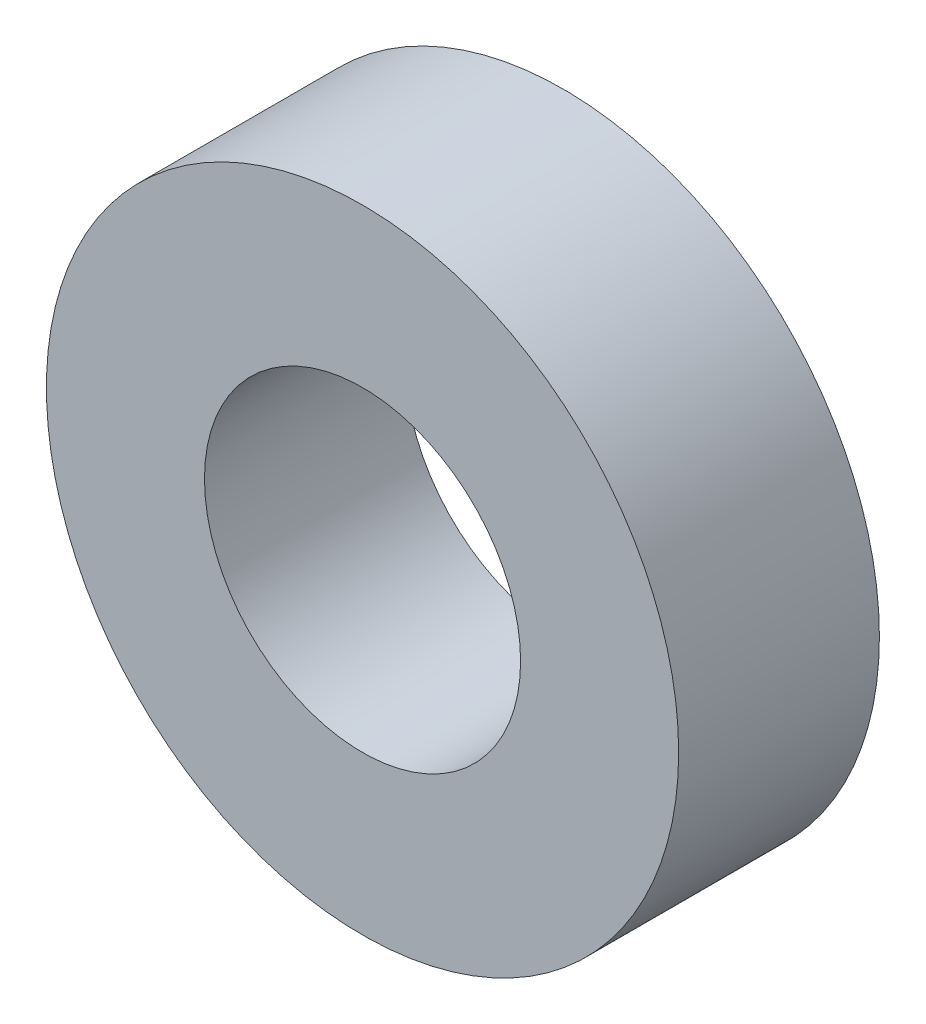
ISO-10303-21;
HEADER;
FILE_DESCRIPTION(('STEP AP214'),'2;1');
FILE_NAME('part.step','',(''),(''),'','','');
FILE_SCHEMA(('AUTOMOTIVE_DESIGN { 1 0 10303 214 1 1 1 1 }'));
ENDSEC;
DATA;
#1=APPLICATION_CONTEXT('core data for automotive mechanical design processes');
#2=APPLICATION_PROTOCOL_DEFINITION('international standard','automotive_design',2000,#1);
#3=PRODUCT_CONTEXT('',#1,'mechanical');
#4=PRODUCT('Part','Part','',(#3));
#5=PRODUCT_RELATED_PRODUCT_CATEGORY('part','',(#4));
#6=PRODUCT_DEFINITION_FORMATION('','',#4);
#7=PRODUCT_DEFINITION_CONTEXT('part definition',#1,'design');
#8=PRODUCT_DEFINITION('design','',#6,#7);
#9=PRODUCT_DEFINITION_SHAPE('','',#8);
#10=(LENGTH_UNIT() NAMED_UNIT(*) SI_UNIT(.MILLI.,.METRE.));
#11=(NAMED_UNIT(*) PLANE_ANGLE_UNIT() SI_UNIT($,.RADIAN.));
#12=(NAMED_UNIT(*) SI_UNIT($,.STERADIAN.) SOLID_ANGLE_UNIT());
#13=UNCERTAINTY_MEASURE_WITH_UNIT(LENGTH_MEASURE(1.E-05),#10,'distance_accuracy_value','');
#14=(GEOMETRIC_REPRESENTATION_CONTEXT(3) GLOBAL_UNCERTAINTY_ASSIGNED_CONTEXT((#13)) GLOBAL_UNIT_ASSIGNED_CONTEXT((#10,
#11,#12)) REPRESENTATION_CONTEXT('',''));
#15=CARTESIAN_POINT('',(0.,0.,0.));
#16=DIRECTION('',(0.,0.,1.));
#17=DIRECTION('',(1.,0.,0.));
#18=AXIS2_PLACEMENT_3D('',#15,#16,#17);
#19=CARTESIAN_POINT('',(0.,0.,2.54));
#20=DIRECTION('',(0.,0.,1.));
#21=DIRECTION('',(1.,0.,0.));
#22=AXIS2_PLACEMENT_3D('',#19,#20,#21);
#23=PLANE('',#22);
#24=CARTESIAN_POINT('',(0.,0.,2.54));
#25=DIRECTION('',(0.,0.,1.));
#26=DIRECTION('',(1.,0.,0.));
#27=AXIS2_PLACEMENT_3D('',#24,#25,#26);
#28=CIRCLE('',#27,4.);
#29=CARTESIAN_POINT('',(4.,0.,2.54));
#30=VERTEX_POINT('',#29);
#31=EDGE_CURVE('E10',#30,#30,#28,.T.);
#32=ORIENTED_EDGE('',*,*,#31,.T.);
#33=EDGE_LOOP('',(#32));
#34=FACE_BOUND('',#33,.T.);
#35=CARTESIAN_POINT('',(0.,0.,2.54));
#36=DIRECTION('',(0.,0.,1.));
#37=DIRECTION('',(1.,0.,0.));
#38=AXIS2_PLACEMENT_3D('',#35,#36,#37);
#39=CIRCLE('',#38,2.);
#40=CARTESIAN_POINT('',(2.,0.,2.54));
#41=VERTEX_POINT('',#40);
#42=EDGE_CURVE('E46',#41,#41,#39,.T.);
#43=ORIENTED_EDGE('',*,*,#42,.F.);
#44=EDGE_LOOP('',(#43));
#45=FACE_BOUND('',#44,.T.);
#46=ADVANCED_FACE('F35',(#34,#45),#23,.T.);
#47=CARTESIAN_POINT('',(0.,0.,0.));
#48=DIRECTION('',(0.,0.,1.));
#49=DIRECTION('',(1.,0.,0.));
#50=AXIS2_PLACEMENT_3D('',#47,#48,#49);
#51=PLANE('',#50);
#52=CARTESIAN_POINT('',(0.,0.,0.));
#53=DIRECTION('',(0.,0.,1.));
#54=DIRECTION('',(1.,0.,0.));
#55=AXIS2_PLACEMENT_3D('',#52,#53,#54);
#56=CIRCLE('',#55,4.);
#57=CARTESIAN_POINT('',(4.,0.,0.));
#58=VERTEX_POINT('',#57);
#59=EDGE_CURVE('E39',#58,#58,#56,.T.);
#60=ORIENTED_EDGE('',*,*,#59,.F.);
#61=EDGE_LOOP('',(#60));
#62=FACE_BOUND('',#61,.T.);
#63=CARTESIAN_POINT('',(0.,0.,0.));
#64=DIRECTION('',(0.,0.,1.));
#65=DIRECTION('',(1.,0.,0.));
#66=AXIS2_PLACEMENT_3D('',#63,#64,#65);
#67=CIRCLE('',#66,2.);
#68=CARTESIAN_POINT('',(2.,0.,0.));
#69=VERTEX_POINT('',#68);
#70=EDGE_CURVE('E48',#69,#69,#67,.T.);
#71=ORIENTED_EDGE('',*,*,#70,.T.);
#72=EDGE_LOOP('',(#71));
#73=FACE_BOUND('',#72,.T.);
#74=ADVANCED_FACE('F58',(#62,#73),#51,.F.);
#75=CARTESIAN_POINT('',(0.,0.,2.54));
#76=DIRECTION('',(0.,0.,-1.));
#77=DIRECTION('',(-1.,0.,0.));
#78=AXIS2_PLACEMENT_3D('',#75,#76,#77);
#79=CYLINDRICAL_SURFACE('',#78,4.);
#80=ORIENTED_EDGE('',*,*,#31,.F.);
#81=EDGE_LOOP('',(#80));
#82=FACE_BOUND('',#81,.T.);
#83=ORIENTED_EDGE('',*,*,#59,.T.);
#84=EDGE_LOOP('',(#83));
#85=FACE_BOUND('',#84,.T.);
#86=ADVANCED_FACE('F37',(#82,#85),#79,.T.);
#87=CARTESIAN_POINT('',(0.,0.,2.54));
#88=DIRECTION('',(0.,0.,-1.));
#89=DIRECTION('',(-1.,0.,0.));
#90=AXIS2_PLACEMENT_3D('',#87,#88,#89);
#91=CYLINDRICAL_SURFACE('',#90,2.);
#92=ORIENTED_EDGE('',*,*,#42,.T.);
#93=EDGE_LOOP('',(#92));
#94=FACE_BOUND('',#93,.T.);
#95=ORIENTED_EDGE('',*,*,#70,.F.);
#96=EDGE_LOOP('',(#95));
#97=FACE_BOUND('',#96,.T.);
#98=ADVANCED_FACE('F54',(#94,#97),#91,.F.);
#99=CLOSED_SHELL('',(#46,#74,#86,#98));
#100=MANIFOLD_SOLID_BREP('B2',#99);
#101=ADVANCED_BREP_SHAPE_REPRESENTATION('',(#18,#100),#14);
#102=SHAPE_DEFINITION_REPRESENTATION(#9,#101);
ENDSEC;
END-ISO-10303-21;
